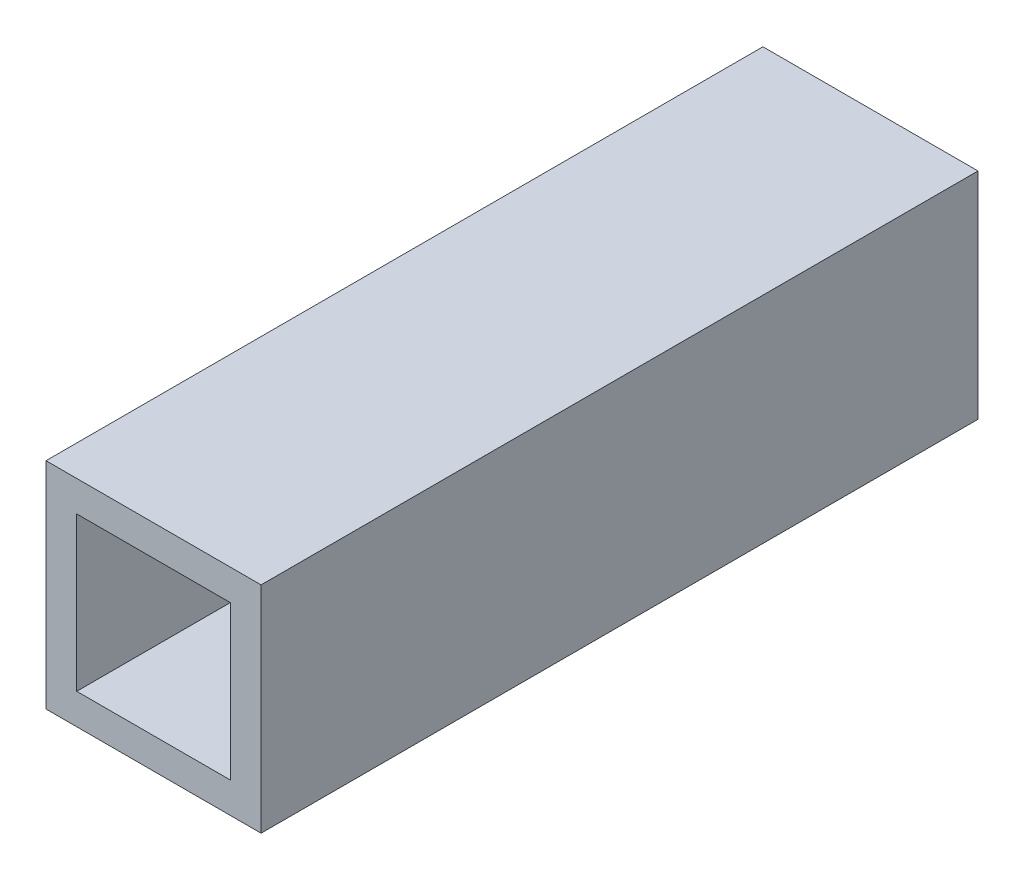
ISO-10303-21;
HEADER;
FILE_DESCRIPTION(('STEP AP214'),'2;1');
FILE_NAME('part.step','',(''),(''),'','','');
FILE_SCHEMA(('AUTOMOTIVE_DESIGN { 1 0 10303 214 1 1 1 1 }'));
ENDSEC;
DATA;
#1=APPLICATION_CONTEXT('core data for automotive mechanical design processes');
#2=APPLICATION_PROTOCOL_DEFINITION('international standard','automotive_design',2000,#1);
#3=PRODUCT_CONTEXT('',#1,'mechanical');
#4=PRODUCT('Part','Part','',(#3));
#5=PRODUCT_RELATED_PRODUCT_CATEGORY('part','',(#4));
#6=PRODUCT_DEFINITION_FORMATION('','',#4);
#7=PRODUCT_DEFINITION_CONTEXT('part definition',#1,'design');
#8=PRODUCT_DEFINITION('design','',#6,#7);
#9=PRODUCT_DEFINITION_SHAPE('','',#8);
#10=(LENGTH_UNIT() NAMED_UNIT(*) SI_UNIT(.MILLI.,.METRE.));
#11=(NAMED_UNIT(*) PLANE_ANGLE_UNIT() SI_UNIT($,.RADIAN.));
#12=(NAMED_UNIT(*) SI_UNIT($,.STERADIAN.) SOLID_ANGLE_UNIT());
#13=UNCERTAINTY_MEASURE_WITH_UNIT(LENGTH_MEASURE(1.E-05),#10,'distance_accuracy_value','');
#14=(GEOMETRIC_REPRESENTATION_CONTEXT(3) GLOBAL_UNCERTAINTY_ASSIGNED_CONTEXT((#13)) GLOBAL_UNIT_ASSIGNED_CONTEXT((#10,
#11,#12)) REPRESENTATION_CONTEXT('',''));
#15=CARTESIAN_POINT('',(0.,0.,0.));
#16=DIRECTION('',(0.,0.,1.));
#17=DIRECTION('',(1.,0.,0.));
#18=AXIS2_PLACEMENT_3D('',#15,#16,#17);
#19=CARTESIAN_POINT('',(0.,0.,70.));
#20=DIRECTION('',(0.,0.,-1.));
#21=DIRECTION('',(-1.,0.,0.));
#22=AXIS2_PLACEMENT_3D('',#19,#20,#21);
#23=PLANE('',#22);
#24=DIRECTION('',(0.,1.,0.));
#25=VECTOR('',#24,1.);
#26=CARTESIAN_POINT('',(10.5,-10.5,70.));
#27=LINE('',#26,#25);
#28=CARTESIAN_POINT('',(10.5,-10.5,70.));
#29=VERTEX_POINT('',#28);
#30=CARTESIAN_POINT('',(10.5,10.5,70.));
#31=VERTEX_POINT('',#30);
#32=EDGE_CURVE('E159',#29,#31,#27,.T.);
#33=ORIENTED_EDGE('',*,*,#32,.T.);
#34=DIRECTION('',(-1.,0.,0.));
#35=VECTOR('',#34,1.);
#36=CARTESIAN_POINT('',(-10.5,10.5,70.));
#37=LINE('',#36,#35);
#38=CARTESIAN_POINT('',(-10.5,10.5,70.));
#39=VERTEX_POINT('',#38);
#40=EDGE_CURVE('E163',#31,#39,#37,.T.);
#41=ORIENTED_EDGE('',*,*,#40,.T.);
#42=DIRECTION('',(0.,-1.,0.));
#43=VECTOR('',#42,1.);
#44=CARTESIAN_POINT('',(-10.5,-10.5,70.));
#45=LINE('',#44,#43);
#46=CARTESIAN_POINT('',(-10.5,-10.5,70.));
#47=VERTEX_POINT('',#46);
#48=EDGE_CURVE('E167',#39,#47,#45,.T.);
#49=ORIENTED_EDGE('',*,*,#48,.T.);
#50=DIRECTION('',(1.,0.,0.));
#51=VECTOR('',#50,1.);
#52=CARTESIAN_POINT('',(-10.5,-10.5,70.));
#53=LINE('',#52,#51);
#54=EDGE_CURVE('E170',#47,#29,#53,.T.);
#55=ORIENTED_EDGE('',*,*,#54,.T.);
#56=EDGE_LOOP('',(#33,#41,#49,#55));
#57=FACE_BOUND('',#56,.T.);
#58=DIRECTION('',(0.,1.,0.));
#59=VECTOR('',#58,1.);
#60=CARTESIAN_POINT('',(7.5,-7.5,70.));
#61=LINE('',#60,#59);
#62=CARTESIAN_POINT('',(7.5,-7.5,70.));
#63=VERTEX_POINT('',#62);
#64=CARTESIAN_POINT('',(7.5,7.5,70.));
#65=VERTEX_POINT('',#64);
#66=EDGE_CURVE('E111',#63,#65,#61,.T.);
#67=ORIENTED_EDGE('',*,*,#66,.F.);
#68=DIRECTION('',(1.,0.,0.));
#69=VECTOR('',#68,1.);
#70=CARTESIAN_POINT('',(-7.5,-7.5,70.));
#71=LINE('',#70,#69);
#72=CARTESIAN_POINT('',(-7.5,-7.5,70.));
#73=VERTEX_POINT('',#72);
#74=EDGE_CURVE('E137',#73,#63,#71,.T.);
#75=ORIENTED_EDGE('',*,*,#74,.F.);
#76=DIRECTION('',(0.,-1.,0.));
#77=VECTOR('',#76,1.);
#78=CARTESIAN_POINT('',(-7.5,-7.5,70.));
#79=LINE('',#78,#77);
#80=CARTESIAN_POINT('',(-7.5,7.5,70.));
#81=VERTEX_POINT('',#80);
#82=EDGE_CURVE('E133',#81,#73,#79,.T.);
#83=ORIENTED_EDGE('',*,*,#82,.F.);
#84=DIRECTION('',(-1.,0.,0.));
#85=VECTOR('',#84,1.);
#86=CARTESIAN_POINT('',(-7.5,7.5,70.));
#87=LINE('',#86,#85);
#88=EDGE_CURVE('E120',#65,#81,#87,.T.);
#89=ORIENTED_EDGE('',*,*,#88,.F.);
#90=EDGE_LOOP('',(#67,#75,#83,#89));
#91=FACE_BOUND('',#90,.T.);
#92=ADVANCED_FACE('F45',(#57,#91),#23,.F.);
#93=CARTESIAN_POINT('',(0.,0.,0.));
#94=DIRECTION('',(0.,0.,-1.));
#95=DIRECTION('',(-1.,0.,0.));
#96=AXIS2_PLACEMENT_3D('',#93,#94,#95);
#97=PLANE('',#96);
#98=DIRECTION('',(0.,1.,0.));
#99=VECTOR('',#98,1.);
#100=CARTESIAN_POINT('',(10.5,-10.5,0.));
#101=LINE('',#100,#99);
#102=CARTESIAN_POINT('',(10.5,-10.5,0.));
#103=VERTEX_POINT('',#102);
#104=CARTESIAN_POINT('',(10.5,10.5,0.));
#105=VERTEX_POINT('',#104);
#106=EDGE_CURVE('E129',#103,#105,#101,.T.);
#107=ORIENTED_EDGE('',*,*,#106,.F.);
#108=DIRECTION('',(1.,0.,0.));
#109=VECTOR('',#108,1.);
#110=CARTESIAN_POINT('',(-10.5,-10.5,0.));
#111=LINE('',#110,#109);
#112=CARTESIAN_POINT('',(-10.5,-10.5,0.));
#113=VERTEX_POINT('',#112);
#114=EDGE_CURVE('E164',#113,#103,#111,.T.);
#115=ORIENTED_EDGE('',*,*,#114,.F.);
#116=DIRECTION('',(0.,-1.,0.));
#117=VECTOR('',#116,1.);
#118=CARTESIAN_POINT('',(-10.5,-10.5,0.));
#119=LINE('',#118,#117);
#120=CARTESIAN_POINT('',(-10.5,10.5,0.));
#121=VERTEX_POINT('',#120);
#122=EDGE_CURVE('E180',#121,#113,#119,.T.);
#123=ORIENTED_EDGE('',*,*,#122,.F.);
#124=DIRECTION('',(-1.,0.,0.));
#125=VECTOR('',#124,1.);
#126=CARTESIAN_POINT('',(-10.5,10.5,0.));
#127=LINE('',#126,#125);
#128=EDGE_CURVE('E177',#105,#121,#127,.T.);
#129=ORIENTED_EDGE('',*,*,#128,.F.);
#130=EDGE_LOOP('',(#107,#115,#123,#129));
#131=FACE_BOUND('',#130,.T.);
#132=DIRECTION('',(1.,0.,0.));
#133=VECTOR('',#132,1.);
#134=CARTESIAN_POINT('',(-7.5,-7.5,0.));
#135=LINE('',#134,#133);
#136=CARTESIAN_POINT('',(-7.5,-7.5,0.));
#137=VERTEX_POINT('',#136);
#138=CARTESIAN_POINT('',(7.5,-7.5,0.));
#139=VERTEX_POINT('',#138);
#140=EDGE_CURVE('E121',#137,#139,#135,.T.);
#141=ORIENTED_EDGE('',*,*,#140,.T.);
#142=DIRECTION('',(0.,1.,0.));
#143=VECTOR('',#142,1.);
#144=CARTESIAN_POINT('',(7.5,-7.5,0.));
#145=LINE('',#144,#143);
#146=CARTESIAN_POINT('',(7.5,7.5,0.));
#147=VERTEX_POINT('',#146);
#148=EDGE_CURVE('E69',#139,#147,#145,.T.);
#149=ORIENTED_EDGE('',*,*,#148,.T.);
#150=DIRECTION('',(-1.,0.,0.));
#151=VECTOR('',#150,1.);
#152=CARTESIAN_POINT('',(-7.5,7.5,0.));
#153=LINE('',#152,#151);
#154=CARTESIAN_POINT('',(-7.5,7.5,0.));
#155=VERTEX_POINT('',#154);
#156=EDGE_CURVE('E127',#147,#155,#153,.T.);
#157=ORIENTED_EDGE('',*,*,#156,.T.);
#158=DIRECTION('',(0.,-1.,0.));
#159=VECTOR('',#158,1.);
#160=CARTESIAN_POINT('',(-7.5,-7.5,0.));
#161=LINE('',#160,#159);
#162=EDGE_CURVE('E146',#155,#137,#161,.T.);
#163=ORIENTED_EDGE('',*,*,#162,.T.);
#164=EDGE_LOOP('',(#141,#149,#157,#163));
#165=FACE_BOUND('',#164,.T.);
#166=ADVANCED_FACE('F203',(#131,#165),#97,.T.);
#167=CARTESIAN_POINT('',(10.5,-10.5,70.));
#168=DIRECTION('',(-1.,0.,0.));
#169=DIRECTION('',(0.,0.,1.));
#170=AXIS2_PLACEMENT_3D('',#167,#168,#169);
#171=PLANE('',#170);
#172=ORIENTED_EDGE('',*,*,#106,.T.);
#173=DIRECTION('',(0.,0.,-1.));
#174=VECTOR('',#173,1.);
#175=CARTESIAN_POINT('',(10.5,10.5,70.));
#176=LINE('',#175,#174);
#177=EDGE_CURVE('E11',#31,#105,#176,.T.);
#178=ORIENTED_EDGE('',*,*,#177,.F.);
#179=ORIENTED_EDGE('',*,*,#32,.F.);
#180=DIRECTION('',(0.,0.,-1.));
#181=VECTOR('',#180,1.);
#182=CARTESIAN_POINT('',(10.5,-10.5,70.));
#183=LINE('',#182,#181);
#184=EDGE_CURVE('E173',#29,#103,#183,.T.);
#185=ORIENTED_EDGE('',*,*,#184,.T.);
#186=EDGE_LOOP('',(#172,#178,#179,#185));
#187=FACE_BOUND('',#186,.T.);
#188=ADVANCED_FACE('F47',(#187),#171,.F.);
#189=CARTESIAN_POINT('',(-10.5,10.5,70.));
#190=DIRECTION('',(0.,-1.,0.));
#191=DIRECTION('',(0.,0.,-1.));
#192=AXIS2_PLACEMENT_3D('',#189,#190,#191);
#193=PLANE('',#192);
#194=ORIENTED_EDGE('',*,*,#128,.T.);
#195=DIRECTION('',(0.,0.,-1.));
#196=VECTOR('',#195,1.);
#197=CARTESIAN_POINT('',(-10.5,10.5,70.));
#198=LINE('',#197,#196);
#199=EDGE_CURVE('E54',#39,#121,#198,.T.);
#200=ORIENTED_EDGE('',*,*,#199,.F.);
#201=ORIENTED_EDGE('',*,*,#40,.F.);
#202=ORIENTED_EDGE('',*,*,#177,.T.);
#203=EDGE_LOOP('',(#194,#200,#201,#202));
#204=FACE_BOUND('',#203,.T.);
#205=ADVANCED_FACE('F213',(#204),#193,.F.);
#206=CARTESIAN_POINT('',(-10.5,-10.5,70.));
#207=DIRECTION('',(1.,0.,0.));
#208=DIRECTION('',(0.,0.,-1.));
#209=AXIS2_PLACEMENT_3D('',#206,#207,#208);
#210=PLANE('',#209);
#211=ORIENTED_EDGE('',*,*,#122,.T.);
#212=DIRECTION('',(0.,0.,-1.));
#213=VECTOR('',#212,1.);
#214=CARTESIAN_POINT('',(-10.5,-10.5,70.));
#215=LINE('',#214,#213);
#216=EDGE_CURVE('E188',#47,#113,#215,.T.);
#217=ORIENTED_EDGE('',*,*,#216,.F.);
#218=ORIENTED_EDGE('',*,*,#48,.F.);
#219=ORIENTED_EDGE('',*,*,#199,.T.);
#220=EDGE_LOOP('',(#211,#217,#218,#219));
#221=FACE_BOUND('',#220,.T.);
#222=ADVANCED_FACE('F197',(#221),#210,.F.);
#223=CARTESIAN_POINT('',(-10.5,-10.5,70.));
#224=DIRECTION('',(0.,1.,0.));
#225=DIRECTION('',(0.,0.,1.));
#226=AXIS2_PLACEMENT_3D('',#223,#224,#225);
#227=PLANE('',#226);
#228=ORIENTED_EDGE('',*,*,#114,.T.);
#229=ORIENTED_EDGE('',*,*,#184,.F.);
#230=ORIENTED_EDGE('',*,*,#54,.F.);
#231=ORIENTED_EDGE('',*,*,#216,.T.);
#232=EDGE_LOOP('',(#228,#229,#230,#231));
#233=FACE_BOUND('',#232,.T.);
#234=ADVANCED_FACE('F207',(#233),#227,.F.);
#235=CARTESIAN_POINT('',(7.5,-7.5,70.));
#236=DIRECTION('',(-1.,0.,0.));
#237=DIRECTION('',(0.,0.,1.));
#238=AXIS2_PLACEMENT_3D('',#235,#236,#237);
#239=PLANE('',#238);
#240=ORIENTED_EDGE('',*,*,#148,.F.);
#241=DIRECTION('',(0.,0.,-1.));
#242=VECTOR('',#241,1.);
#243=CARTESIAN_POINT('',(7.5,-7.5,70.));
#244=LINE('',#243,#242);
#245=EDGE_CURVE('E115',#63,#139,#244,.T.);
#246=ORIENTED_EDGE('',*,*,#245,.F.);
#247=ORIENTED_EDGE('',*,*,#66,.T.);
#248=DIRECTION('',(0.,0.,-1.));
#249=VECTOR('',#248,1.);
#250=CARTESIAN_POINT('',(7.5,7.5,70.));
#251=LINE('',#250,#249);
#252=EDGE_CURVE('E114',#65,#147,#251,.T.);
#253=ORIENTED_EDGE('',*,*,#252,.T.);
#254=EDGE_LOOP('',(#240,#246,#247,#253));
#255=FACE_BOUND('',#254,.T.);
#256=ADVANCED_FACE('F113',(#255),#239,.T.);
#257=CARTESIAN_POINT('',(-7.5,7.5,70.));
#258=DIRECTION('',(0.,-1.,0.));
#259=DIRECTION('',(0.,0.,-1.));
#260=AXIS2_PLACEMENT_3D('',#257,#258,#259);
#261=PLANE('',#260);
#262=ORIENTED_EDGE('',*,*,#156,.F.);
#263=ORIENTED_EDGE('',*,*,#252,.F.);
#264=ORIENTED_EDGE('',*,*,#88,.T.);
#265=DIRECTION('',(0.,0.,-1.));
#266=VECTOR('',#265,1.);
#267=CARTESIAN_POINT('',(-7.5,7.5,70.));
#268=LINE('',#267,#266);
#269=EDGE_CURVE('E130',#81,#155,#268,.T.);
#270=ORIENTED_EDGE('',*,*,#269,.T.);
#271=EDGE_LOOP('',(#262,#263,#264,#270));
#272=FACE_BOUND('',#271,.T.);
#273=ADVANCED_FACE('F124',(#272),#261,.T.);
#274=CARTESIAN_POINT('',(-7.5,-7.5,70.));
#275=DIRECTION('',(1.,0.,0.));
#276=DIRECTION('',(0.,0.,-1.));
#277=AXIS2_PLACEMENT_3D('',#274,#275,#276);
#278=PLANE('',#277);
#279=ORIENTED_EDGE('',*,*,#162,.F.);
#280=ORIENTED_EDGE('',*,*,#269,.F.);
#281=ORIENTED_EDGE('',*,*,#82,.T.);
#282=DIRECTION('',(0.,0.,-1.));
#283=VECTOR('',#282,1.);
#284=CARTESIAN_POINT('',(-7.5,-7.5,70.));
#285=LINE('',#284,#283);
#286=EDGE_CURVE('E61',#73,#137,#285,.T.);
#287=ORIENTED_EDGE('',*,*,#286,.T.);
#288=EDGE_LOOP('',(#279,#280,#281,#287));
#289=FACE_BOUND('',#288,.T.);
#290=ADVANCED_FACE('F236',(#289),#278,.T.);
#291=CARTESIAN_POINT('',(-7.5,-7.5,70.));
#292=DIRECTION('',(0.,1.,0.));
#293=DIRECTION('',(0.,0.,1.));
#294=AXIS2_PLACEMENT_3D('',#291,#292,#293);
#295=PLANE('',#294);
#296=ORIENTED_EDGE('',*,*,#140,.F.);
#297=ORIENTED_EDGE('',*,*,#286,.F.);
#298=ORIENTED_EDGE('',*,*,#74,.T.);
#299=ORIENTED_EDGE('',*,*,#245,.T.);
#300=EDGE_LOOP('',(#296,#297,#298,#299));
#301=FACE_BOUND('',#300,.T.);
#302=ADVANCED_FACE('F240',(#301),#295,.T.);
#303=CLOSED_SHELL('',(#92,#166,#188,#205,#222,#234,#256,#273,#290,#302));
#304=MANIFOLD_SOLID_BREP('B2',#303);
#305=ADVANCED_BREP_SHAPE_REPRESENTATION('',(#18,#304),#14);
#306=SHAPE_DEFINITION_REPRESENTATION(#9,#305);
ENDSEC;
END-ISO-10303-21;
